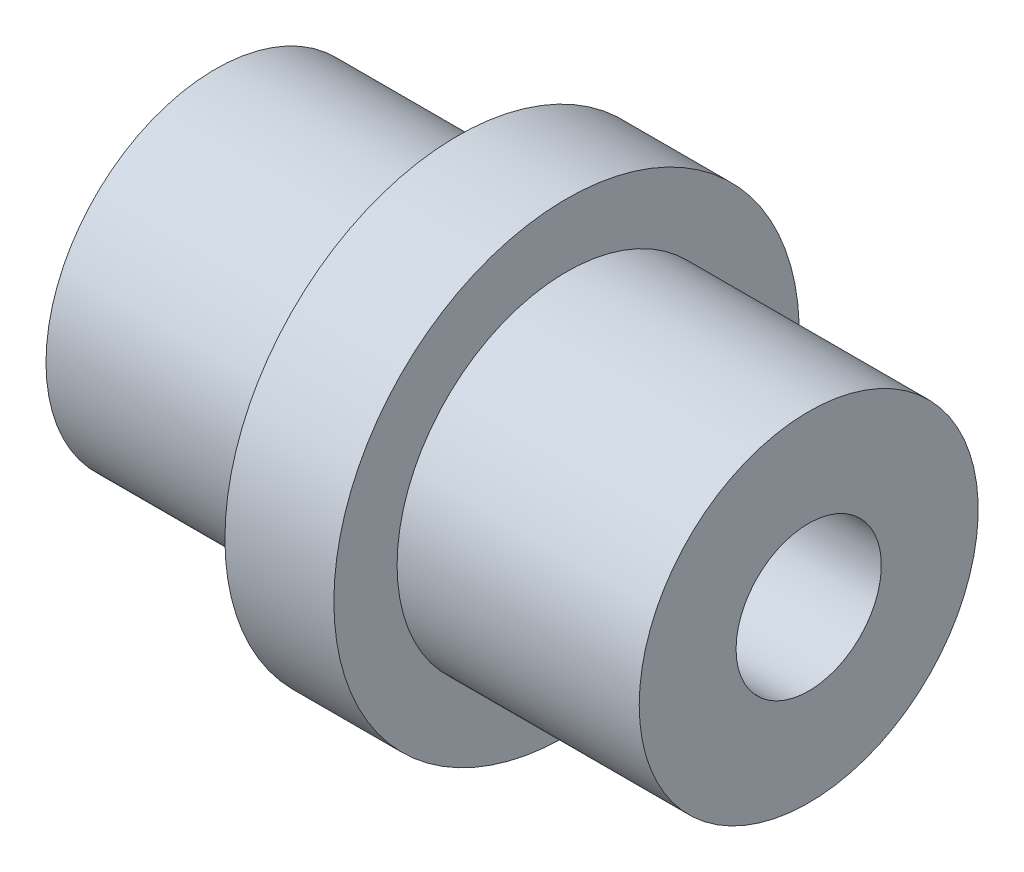
ISO-10303-21;
HEADER;
FILE_DESCRIPTION(('STEP AP214'),'2;1');
FILE_NAME('part.step','',(''),(''),'','','');
FILE_SCHEMA(('AUTOMOTIVE_DESIGN { 1 0 10303 214 1 1 1 1 }'));
ENDSEC;
DATA;
#1=APPLICATION_CONTEXT('core data for automotive mechanical design processes');
#2=APPLICATION_PROTOCOL_DEFINITION('international standard','automotive_design',2000,#1);
#3=PRODUCT_CONTEXT('',#1,'mechanical');
#4=PRODUCT('Part','Part','',(#3));
#5=PRODUCT_RELATED_PRODUCT_CATEGORY('part','',(#4));
#6=PRODUCT_DEFINITION_FORMATION('','',#4);
#7=PRODUCT_DEFINITION_CONTEXT('part definition',#1,'design');
#8=PRODUCT_DEFINITION('design','',#6,#7);
#9=PRODUCT_DEFINITION_SHAPE('','',#8);
#10=(LENGTH_UNIT() NAMED_UNIT(*) SI_UNIT(.MILLI.,.METRE.));
#11=(NAMED_UNIT(*) PLANE_ANGLE_UNIT() SI_UNIT($,.RADIAN.));
#12=(NAMED_UNIT(*) SI_UNIT($,.STERADIAN.) SOLID_ANGLE_UNIT());
#13=UNCERTAINTY_MEASURE_WITH_UNIT(LENGTH_MEASURE(1.E-05),#10,'distance_accuracy_value','');
#14=(GEOMETRIC_REPRESENTATION_CONTEXT(3) GLOBAL_UNCERTAINTY_ASSIGNED_CONTEXT((#13)) GLOBAL_UNIT_ASSIGNED_CONTEXT((#10,
#11,#12)) REPRESENTATION_CONTEXT('',''));
#15=CARTESIAN_POINT('',(0.,0.,0.));
#16=DIRECTION('',(0.,0.,1.));
#17=DIRECTION('',(1.,0.,0.));
#18=AXIS2_PLACEMENT_3D('',#15,#16,#17);
#19=CARTESIAN_POINT('',(0.,0.,0.));
#20=DIRECTION('',(-1.,0.,0.));
#21=DIRECTION('',(0.,0.,1.));
#22=AXIS2_PLACEMENT_3D('',#19,#20,#21);
#23=CYLINDRICAL_SURFACE('',#22,3.);
#24=CARTESIAN_POINT('',(24.5,0.,0.));
#25=DIRECTION('',(-1.,0.,0.));
#26=DIRECTION('',(0.,0.,1.));
#27=AXIS2_PLACEMENT_3D('',#24,#25,#26);
#28=CIRCLE('',#27,3.);
#29=CARTESIAN_POINT('',(24.5,0.,3.));
#30=VERTEX_POINT('',#29);
#31=EDGE_CURVE('E64',#30,#30,#28,.T.);
#32=ORIENTED_EDGE('',*,*,#31,.F.);
#33=EDGE_LOOP('',(#32));
#34=FACE_BOUND('',#33,.T.);
#35=CARTESIAN_POINT('',(0.,0.,0.));
#36=DIRECTION('',(-1.,0.,0.));
#37=DIRECTION('',(0.,0.,1.));
#38=AXIS2_PLACEMENT_3D('',#35,#36,#37);
#39=CIRCLE('',#38,3.);
#40=CARTESIAN_POINT('',(0.,0.,3.));
#41=VERTEX_POINT('',#40);
#42=EDGE_CURVE('E10',#41,#41,#39,.T.);
#43=ORIENTED_EDGE('',*,*,#42,.T.);
#44=EDGE_LOOP('',(#43));
#45=FACE_BOUND('',#44,.T.);
#46=ADVANCED_FACE('F36',(#34,#45),#23,.F.);
#47=CARTESIAN_POINT('',(0.,3.,0.));
#48=DIRECTION('',(1.,0.,0.));
#49=DIRECTION('',(0.,0.,-1.));
#50=AXIS2_PLACEMENT_3D('',#47,#48,#49);
#51=PLANE('',#50);
#52=ORIENTED_EDGE('',*,*,#42,.F.);
#53=EDGE_LOOP('',(#52));
#54=FACE_BOUND('',#53,.T.);
#55=CARTESIAN_POINT('',(0.,0.,0.));
#56=DIRECTION('',(-1.,0.,0.));
#57=DIRECTION('',(0.,0.,1.));
#58=AXIS2_PLACEMENT_3D('',#55,#56,#57);
#59=CIRCLE('',#58,7.);
#60=CARTESIAN_POINT('',(0.,0.,7.));
#61=VERTEX_POINT('',#60);
#62=EDGE_CURVE('E42',#61,#61,#59,.T.);
#63=ORIENTED_EDGE('',*,*,#62,.T.);
#64=EDGE_LOOP('',(#63));
#65=FACE_BOUND('',#64,.T.);
#66=ADVANCED_FACE('F71',(#54,#65),#51,.F.);
#67=CARTESIAN_POINT('',(0.,0.,0.));
#68=DIRECTION('',(-1.,0.,0.));
#69=DIRECTION('',(0.,0.,1.));
#70=AXIS2_PLACEMENT_3D('',#67,#68,#69);
#71=CYLINDRICAL_SURFACE('',#70,7.);
#72=ORIENTED_EDGE('',*,*,#62,.F.);
#73=EDGE_LOOP('',(#72));
#74=FACE_BOUND('',#73,.T.);
#75=CARTESIAN_POINT('',(10.,0.,0.));
#76=DIRECTION('',(-1.,0.,0.));
#77=DIRECTION('',(0.,0.,1.));
#78=AXIS2_PLACEMENT_3D('',#75,#76,#77);
#79=CIRCLE('',#78,7.);
#80=CARTESIAN_POINT('',(10.,0.,7.));
#81=VERTEX_POINT('',#80);
#82=EDGE_CURVE('E46',#81,#81,#79,.T.);
#83=ORIENTED_EDGE('',*,*,#82,.T.);
#84=EDGE_LOOP('',(#83));
#85=FACE_BOUND('',#84,.T.);
#86=ADVANCED_FACE('F75',(#74,#85),#71,.T.);
#87=CARTESIAN_POINT('',(10.,7.,0.));
#88=DIRECTION('',(1.,0.,0.));
#89=DIRECTION('',(0.,0.,-1.));
#90=AXIS2_PLACEMENT_3D('',#87,#88,#89);
#91=PLANE('',#90);
#92=ORIENTED_EDGE('',*,*,#82,.F.);
#93=EDGE_LOOP('',(#92));
#94=FACE_BOUND('',#93,.T.);
#95=CARTESIAN_POINT('',(10.,0.,0.));
#96=DIRECTION('',(-1.,0.,0.));
#97=DIRECTION('',(0.,0.,1.));
#98=AXIS2_PLACEMENT_3D('',#95,#96,#97);
#99=CIRCLE('',#98,9.61095953170126);
#100=CARTESIAN_POINT('',(10.,0.,9.61095953170126));
#101=VERTEX_POINT('',#100);
#102=EDGE_CURVE('E50',#101,#101,#99,.T.);
#103=ORIENTED_EDGE('',*,*,#102,.T.);
#104=EDGE_LOOP('',(#103));
#105=FACE_BOUND('',#104,.T.);
#106=ADVANCED_FACE('F80',(#94,#105),#91,.F.);
#107=CARTESIAN_POINT('',(0.,0.,0.));
#108=DIRECTION('',(-1.,0.,0.));
#109=DIRECTION('',(0.,0.,1.));
#110=AXIS2_PLACEMENT_3D('',#107,#108,#109);
#111=CYLINDRICAL_SURFACE('',#110,9.61095953170126);
#112=ORIENTED_EDGE('',*,*,#102,.F.);
#113=EDGE_LOOP('',(#112));
#114=FACE_BOUND('',#113,.T.);
#115=CARTESIAN_POINT('',(14.5,0.,0.));
#116=DIRECTION('',(-1.,0.,0.));
#117=DIRECTION('',(0.,0.,1.));
#118=AXIS2_PLACEMENT_3D('',#115,#116,#117);
#119=CIRCLE('',#118,9.61095953170126);
#120=CARTESIAN_POINT('',(14.5,0.,9.61095953170126));
#121=VERTEX_POINT('',#120);
#122=EDGE_CURVE('E55',#121,#121,#119,.T.);
#123=ORIENTED_EDGE('',*,*,#122,.T.);
#124=EDGE_LOOP('',(#123));
#125=FACE_BOUND('',#124,.T.);
#126=ADVANCED_FACE('F86',(#114,#125),#111,.T.);
#127=CARTESIAN_POINT('',(14.5,9.61095953170126,0.));
#128=DIRECTION('',(-1.,0.,0.));
#129=DIRECTION('',(0.,0.,1.));
#130=AXIS2_PLACEMENT_3D('',#127,#128,#129);
#131=PLANE('',#130);
#132=ORIENTED_EDGE('',*,*,#122,.F.);
#133=EDGE_LOOP('',(#132));
#134=FACE_BOUND('',#133,.T.);
#135=CARTESIAN_POINT('',(14.5,0.,0.));
#136=DIRECTION('',(-1.,0.,0.));
#137=DIRECTION('',(0.,0.,1.));
#138=AXIS2_PLACEMENT_3D('',#135,#136,#137);
#139=CIRCLE('',#138,7.);
#140=CARTESIAN_POINT('',(14.5,0.,7.));
#141=VERTEX_POINT('',#140);
#142=EDGE_CURVE('E58',#141,#141,#139,.T.);
#143=ORIENTED_EDGE('',*,*,#142,.T.);
#144=EDGE_LOOP('',(#143));
#145=FACE_BOUND('',#144,.T.);
#146=ADVANCED_FACE('F90',(#134,#145),#131,.F.);
#147=CARTESIAN_POINT('',(0.,0.,0.));
#148=DIRECTION('',(-1.,0.,0.));
#149=DIRECTION('',(0.,0.,1.));
#150=AXIS2_PLACEMENT_3D('',#147,#148,#149);
#151=CYLINDRICAL_SURFACE('',#150,7.);
#152=ORIENTED_EDGE('',*,*,#142,.F.);
#153=EDGE_LOOP('',(#152));
#154=FACE_BOUND('',#153,.T.);
#155=CARTESIAN_POINT('',(24.5,0.,0.));
#156=DIRECTION('',(-1.,0.,0.));
#157=DIRECTION('',(0.,0.,1.));
#158=AXIS2_PLACEMENT_3D('',#155,#156,#157);
#159=CIRCLE('',#158,7.);
#160=CARTESIAN_POINT('',(24.5,0.,7.));
#161=VERTEX_POINT('',#160);
#162=EDGE_CURVE('E61',#161,#161,#159,.T.);
#163=ORIENTED_EDGE('',*,*,#162,.T.);
#164=EDGE_LOOP('',(#163));
#165=FACE_BOUND('',#164,.T.);
#166=ADVANCED_FACE('F94',(#154,#165),#151,.T.);
#167=CARTESIAN_POINT('',(24.5,7.,0.));
#168=DIRECTION('',(-1.,0.,0.));
#169=DIRECTION('',(0.,0.,1.));
#170=AXIS2_PLACEMENT_3D('',#167,#168,#169);
#171=PLANE('',#170);
#172=ORIENTED_EDGE('',*,*,#162,.F.);
#173=EDGE_LOOP('',(#172));
#174=FACE_BOUND('',#173,.T.);
#175=ORIENTED_EDGE('',*,*,#31,.T.);
#176=EDGE_LOOP('',(#175));
#177=FACE_BOUND('',#176,.T.);
#178=ADVANCED_FACE('F68',(#174,#177),#171,.F.);
#179=CLOSED_SHELL('',(#46,#66,#86,#106,#126,#146,#166,#178));
#180=MANIFOLD_SOLID_BREP('B2',#179);
#181=ADVANCED_BREP_SHAPE_REPRESENTATION('',(#18,#180),#14);
#182=SHAPE_DEFINITION_REPRESENTATION(#9,#181);
ENDSEC;
END-ISO-10303-21;
